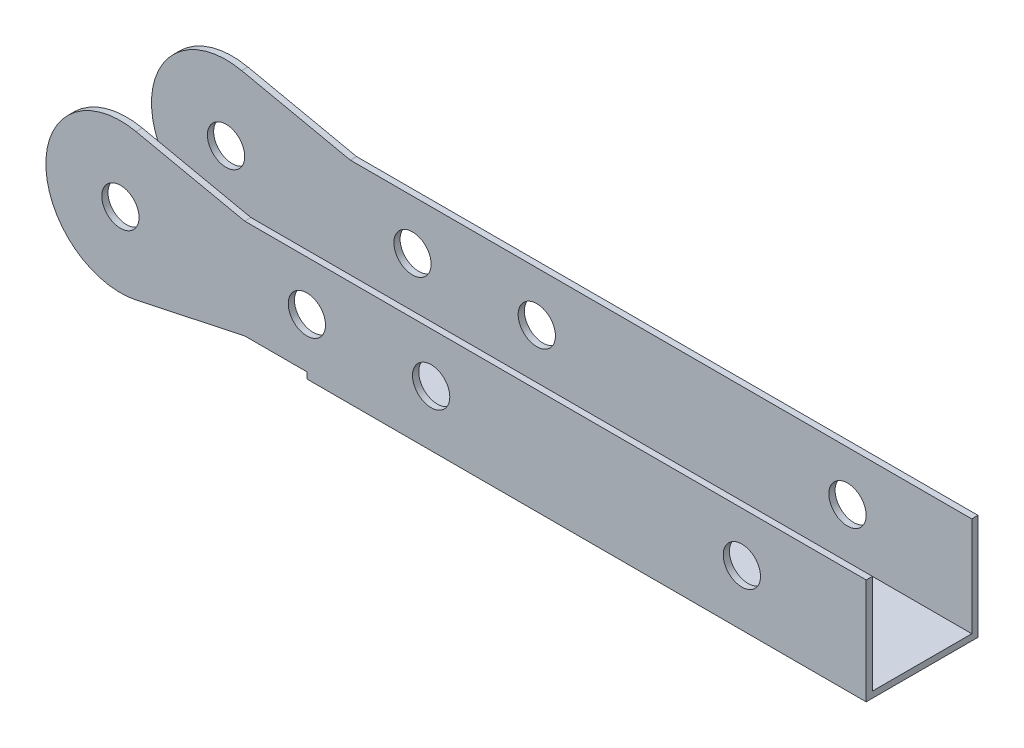
ISO-10303-21;
HEADER;
FILE_DESCRIPTION(('STEP AP214'),'2;1');
FILE_NAME('part.step','',(''),(''),'','','');
FILE_SCHEMA(('AUTOMOTIVE_DESIGN { 1 0 10303 214 1 1 1 1 }'));
ENDSEC;
DATA;
#1=APPLICATION_CONTEXT('core data for automotive mechanical design processes');
#2=APPLICATION_PROTOCOL_DEFINITION('international standard','automotive_design',2000,#1);
#3=PRODUCT_CONTEXT('',#1,'mechanical');
#4=PRODUCT('Part','Part','',(#3));
#5=PRODUCT_RELATED_PRODUCT_CATEGORY('part','',(#4));
#6=PRODUCT_DEFINITION_FORMATION('','',#4);
#7=PRODUCT_DEFINITION_CONTEXT('part definition',#1,'design');
#8=PRODUCT_DEFINITION('design','',#6,#7);
#9=PRODUCT_DEFINITION_SHAPE('','',#8);
#10=(LENGTH_UNIT() NAMED_UNIT(*) SI_UNIT(.MILLI.,.METRE.));
#11=(NAMED_UNIT(*) PLANE_ANGLE_UNIT() SI_UNIT($,.RADIAN.));
#12=(NAMED_UNIT(*) SI_UNIT($,.STERADIAN.) SOLID_ANGLE_UNIT());
#13=UNCERTAINTY_MEASURE_WITH_UNIT(LENGTH_MEASURE(1.E-05),#10,'distance_accuracy_value','');
#14=(GEOMETRIC_REPRESENTATION_CONTEXT(3) GLOBAL_UNCERTAINTY_ASSIGNED_CONTEXT((#13)) GLOBAL_UNIT_ASSIGNED_CONTEXT((#10,
#11,#12)) REPRESENTATION_CONTEXT('',''));
#15=CARTESIAN_POINT('',(0.,0.,0.));
#16=DIRECTION('',(0.,0.,1.));
#17=DIRECTION('',(1.,0.,0.));
#18=AXIS2_PLACEMENT_3D('',#15,#16,#17);
#19=CARTESIAN_POINT('',(-26.8000000000001,0.0103930383316599,8.5));
#20=DIRECTION('',(0.,1.,0.));
#21=DIRECTION('',(0.,0.,1.));
#22=AXIS2_PLACEMENT_3D('',#19,#20,#21);
#23=PLANE('',#22);
#24=DIRECTION('',(0.,0.,-1.));
#25=VECTOR('',#24,1.);
#26=CARTESIAN_POINT('',(-21.8000000000001,0.0103930383316599,-0.500000000000006));
#27=LINE('',#26,#25);
#28=CARTESIAN_POINT('',(-21.8000000000001,0.0103930383316599,8.5));
#29=VERTEX_POINT('',#28);
#30=CARTESIAN_POINT('',(-21.8000000000001,0.0103930383316599,8.));
#31=VERTEX_POINT('',#30);
#32=EDGE_CURVE('E152',#29,#31,#27,.T.);
#33=ORIENTED_EDGE('',*,*,#32,.F.);
#34=DIRECTION('',(1.,0.,0.));
#35=VECTOR('',#34,1.);
#36=CARTESIAN_POINT('',(-26.8000000000001,0.0103930383316599,8.5));
#37=LINE('',#36,#35);
#38=CARTESIAN_POINT('',(-26.8000000000001,0.0103930383316599,8.5));
#39=VERTEX_POINT('',#38);
#40=EDGE_CURVE('E120',#39,#29,#37,.T.);
#41=ORIENTED_EDGE('',*,*,#40,.F.);
#42=DIRECTION('',(0.,0.,-1.));
#43=VECTOR('',#42,1.);
#44=CARTESIAN_POINT('',(-26.8000000000001,0.0103930383316599,8.5));
#45=LINE('',#44,#43);
#46=CARTESIAN_POINT('',(-26.8000000000001,0.0103930383316599,8.));
#47=VERTEX_POINT('',#46);
#48=EDGE_CURVE('E115',#39,#47,#45,.T.);
#49=ORIENTED_EDGE('',*,*,#48,.T.);
#50=DIRECTION('',(1.,0.,0.));
#51=VECTOR('',#50,1.);
#52=CARTESIAN_POINT('',(-26.8000000000001,0.0103930383316599,8.));
#53=LINE('',#52,#51);
#54=EDGE_CURVE('E136',#47,#31,#53,.T.);
#55=ORIENTED_EDGE('',*,*,#54,.T.);
#56=EDGE_LOOP('',(#33,#41,#49,#55));
#57=FACE_BOUND('',#56,.T.);
#58=ADVANCED_FACE('F37',(#57),#23,.F.);
#59=CARTESIAN_POINT('',(-36.8000000000001,4.01039303833166,8.5));
#60=DIRECTION('',(0.,0.,1.));
#61=DIRECTION('',(1.,0.,0.));
#62=AXIS2_PLACEMENT_3D('',#59,#60,#61);
#63=PLANE('',#62);
#64=CARTESIAN_POINT('',(-21.8000000000001,4.01039303833166,8.5));
#65=DIRECTION('',(0.,0.,1.));
#66=DIRECTION('',(1.,0.,0.));
#67=AXIS2_PLACEMENT_3D('',#64,#65,#66);
#68=CIRCLE('',#67,1.5);
#69=CARTESIAN_POINT('',(-20.3000000000001,4.01039303833166,8.5));
#70=VERTEX_POINT('',#69);
#71=EDGE_CURVE('E300',#70,#70,#68,.T.);
#72=ORIENTED_EDGE('',*,*,#71,.F.);
#73=EDGE_LOOP('',(#72));
#74=FACE_BOUND('',#73,.T.);
#75=CARTESIAN_POINT('',(13.1999999999999,4.01039303833166,8.5));
#76=DIRECTION('',(0.,0.,1.));
#77=DIRECTION('',(1.,0.,0.));
#78=AXIS2_PLACEMENT_3D('',#75,#76,#77);
#79=CIRCLE('',#78,1.5);
#80=CARTESIAN_POINT('',(14.6999999999999,4.01039303833166,8.5));
#81=VERTEX_POINT('',#80);
#82=EDGE_CURVE('E131',#81,#81,#79,.T.);
#83=ORIENTED_EDGE('',*,*,#82,.F.);
#84=EDGE_LOOP('',(#83));
#85=FACE_BOUND('',#84,.T.);
#86=DIRECTION('',(-1.,0.,0.));
#87=VECTOR('',#86,1.);
#88=CARTESIAN_POINT('',(23.1999999999999,8.01039303833166,8.5));
#89=LINE('',#88,#87);
#90=CARTESIAN_POINT('',(23.1999999999999,8.01039303833166,8.5));
#91=VERTEX_POINT('',#90);
#92=CARTESIAN_POINT('',(-26.8000000000001,8.01039303833165,8.5));
#93=VERTEX_POINT('',#92);
#94=EDGE_CURVE('E140',#91,#93,#89,.T.);
#95=ORIENTED_EDGE('',*,*,#94,.T.);
#96=DIRECTION('',(-0.977954474999927,0.20881821000003,0.));
#97=VECTOR('',#96,1.);
#98=CARTESIAN_POINT('',(-26.8000000000001,8.01039303833165,8.5));
#99=LINE('',#98,#97);
#100=CARTESIAN_POINT('',(-35.5470907399999,9.87811988833122,8.5));
#101=VERTEX_POINT('',#100);
#102=EDGE_CURVE('E91',#93,#101,#99,.T.);
#103=ORIENTED_EDGE('',*,*,#102,.T.);
#104=CARTESIAN_POINT('',(-36.8000000000001,4.01039303833166,8.5));
#105=DIRECTION('',(0.,0.,1.));
#106=DIRECTION('',(1.,0.,0.));
#107=AXIS2_PLACEMENT_3D('',#104,#105,#106);
#108=CIRCLE('',#107,6.);
#109=CARTESIAN_POINT('',(-35.5470907399999,-1.85733381166791,8.5));
#110=VERTEX_POINT('',#109);
#111=EDGE_CURVE('E97',#101,#110,#108,.T.);
#112=ORIENTED_EDGE('',*,*,#111,.T.);
#113=DIRECTION('',(0.977954474999928,0.208818210000029,0.));
#114=VECTOR('',#113,1.);
#115=CARTESIAN_POINT('',(-35.5470907399999,-1.85733381166791,8.5));
#116=LINE('',#115,#114);
#117=EDGE_CURVE('E103',#110,#39,#116,.T.);
#118=ORIENTED_EDGE('',*,*,#117,.T.);
#119=ORIENTED_EDGE('',*,*,#40,.T.);
#120=DIRECTION('',(0.,1.,0.));
#121=VECTOR('',#120,1.);
#122=CARTESIAN_POINT('',(-21.8000000000001,-0.48960696166834,8.5));
#123=LINE('',#122,#121);
#124=CARTESIAN_POINT('',(-21.8000000000001,-0.48960696166834,8.5));
#125=VERTEX_POINT('',#124);
#126=EDGE_CURVE('E156',#125,#29,#123,.T.);
#127=ORIENTED_EDGE('',*,*,#126,.F.);
#128=DIRECTION('',(-1.,0.,0.));
#129=VECTOR('',#128,1.);
#130=CARTESIAN_POINT('',(-21.8000000000001,-0.48960696166834,8.5));
#131=LINE('',#130,#129);
#132=CARTESIAN_POINT('',(23.1999999999999,-0.48960696166834,8.5));
#133=VERTEX_POINT('',#132);
#134=EDGE_CURVE('E274',#133,#125,#131,.T.);
#135=ORIENTED_EDGE('',*,*,#134,.F.);
#136=DIRECTION('',(0.,1.,0.));
#137=VECTOR('',#136,1.);
#138=CARTESIAN_POINT('',(23.1999999999999,0.0103930383316599,8.5));
#139=LINE('',#138,#137);
#140=EDGE_CURVE('E54',#133,#91,#139,.T.);
#141=ORIENTED_EDGE('',*,*,#140,.T.);
#142=EDGE_LOOP('',(#95,#103,#112,#118,#119,#127,#135,#141));
#143=FACE_BOUND('',#142,.T.);
#144=CARTESIAN_POINT('',(-11.8000000000001,4.01039303833166,8.5));
#145=DIRECTION('',(0.,0.,1.));
#146=DIRECTION('',(1.,0.,0.));
#147=AXIS2_PLACEMENT_3D('',#144,#145,#146);
#148=CIRCLE('',#147,1.5);
#149=CARTESIAN_POINT('',(-10.3000000000001,4.01039303833166,8.5));
#150=VERTEX_POINT('',#149);
#151=EDGE_CURVE('E306',#150,#150,#148,.T.);
#152=ORIENTED_EDGE('',*,*,#151,.F.);
#153=EDGE_LOOP('',(#152));
#154=FACE_BOUND('',#153,.T.);
#155=CARTESIAN_POINT('',(-36.8000000000001,4.01039303833166,8.5));
#156=DIRECTION('',(0.,0.,1.));
#157=DIRECTION('',(1.,0.,0.));
#158=AXIS2_PLACEMENT_3D('',#155,#156,#157);
#159=CIRCLE('',#158,1.5);
#160=CARTESIAN_POINT('',(-35.3000000000001,4.01039303833166,8.5));
#161=VERTEX_POINT('',#160);
#162=EDGE_CURVE('E294',#161,#161,#159,.T.);
#163=ORIENTED_EDGE('',*,*,#162,.F.);
#164=EDGE_LOOP('',(#163));
#165=FACE_BOUND('',#164,.T.);
#166=ADVANCED_FACE('F99',(#74,#85,#143,#154,#165),#63,.T.);
#167=CARTESIAN_POINT('',(-36.8000000000001,4.01039303833166,8.));
#168=DIRECTION('',(0.,0.,1.));
#169=DIRECTION('',(1.,0.,0.));
#170=AXIS2_PLACEMENT_3D('',#167,#168,#169);
#171=PLANE('',#170);
#172=DIRECTION('',(-1.,0.,0.));
#173=VECTOR('',#172,1.);
#174=CARTESIAN_POINT('',(23.1999999999999,8.01039303833166,8.));
#175=LINE('',#174,#173);
#176=CARTESIAN_POINT('',(23.1999999999999,8.01039303833166,8.));
#177=VERTEX_POINT('',#176);
#178=CARTESIAN_POINT('',(-26.8000000000001,8.01039303833165,8.));
#179=VERTEX_POINT('',#178);
#180=EDGE_CURVE('E127',#177,#179,#175,.T.);
#181=ORIENTED_EDGE('',*,*,#180,.F.);
#182=DIRECTION('',(0.,1.,0.));
#183=VECTOR('',#182,1.);
#184=CARTESIAN_POINT('',(23.1999999999999,0.0103930383316599,8.));
#185=LINE('',#184,#183);
#186=CARTESIAN_POINT('',(23.1999999999999,0.0103930383316599,8.));
#187=VERTEX_POINT('',#186);
#188=EDGE_CURVE('E83',#187,#177,#185,.T.);
#189=ORIENTED_EDGE('',*,*,#188,.F.);
#190=DIRECTION('',(-1.,0.,0.));
#191=VECTOR('',#190,1.);
#192=CARTESIAN_POINT('',(-36.8000000000001,0.0103930383316599,8.));
#193=LINE('',#192,#191);
#194=EDGE_CURVE('E291',#187,#31,#193,.T.);
#195=ORIENTED_EDGE('',*,*,#194,.T.);
#196=ORIENTED_EDGE('',*,*,#54,.F.);
#197=DIRECTION('',(0.977954474999928,0.208818210000029,0.));
#198=VECTOR('',#197,1.);
#199=CARTESIAN_POINT('',(-35.5470907399999,-1.85733381166791,8.));
#200=LINE('',#199,#198);
#201=CARTESIAN_POINT('',(-35.5470907399999,-1.85733381166791,8.));
#202=VERTEX_POINT('',#201);
#203=EDGE_CURVE('E134',#202,#47,#200,.T.);
#204=ORIENTED_EDGE('',*,*,#203,.F.);
#205=CARTESIAN_POINT('',(-36.8000000000001,4.01039303833166,8.));
#206=DIRECTION('',(0.,0.,1.));
#207=DIRECTION('',(1.,0.,0.));
#208=AXIS2_PLACEMENT_3D('',#205,#206,#207);
#209=CIRCLE('',#208,6.);
#210=CARTESIAN_POINT('',(-35.5470907399999,9.87811988833122,8.));
#211=VERTEX_POINT('',#210);
#212=EDGE_CURVE('E112',#211,#202,#209,.T.);
#213=ORIENTED_EDGE('',*,*,#212,.F.);
#214=DIRECTION('',(-0.977954474999927,0.20881821000003,0.));
#215=VECTOR('',#214,1.);
#216=CARTESIAN_POINT('',(-26.8000000000001,8.01039303833165,8.));
#217=LINE('',#216,#215);
#218=EDGE_CURVE('E130',#179,#211,#217,.T.);
#219=ORIENTED_EDGE('',*,*,#218,.F.);
#220=EDGE_LOOP('',(#181,#189,#195,#196,#204,#213,#219));
#221=FACE_BOUND('',#220,.T.);
#222=CARTESIAN_POINT('',(13.1999999999999,4.01039303833166,8.));
#223=DIRECTION('',(0.,0.,1.));
#224=DIRECTION('',(1.,0.,0.));
#225=AXIS2_PLACEMENT_3D('',#222,#223,#224);
#226=CIRCLE('',#225,1.5);
#227=CARTESIAN_POINT('',(14.6999999999999,4.01039303833166,8.));
#228=VERTEX_POINT('',#227);
#229=EDGE_CURVE('E309',#228,#228,#226,.T.);
#230=ORIENTED_EDGE('',*,*,#229,.T.);
#231=EDGE_LOOP('',(#230));
#232=FACE_BOUND('',#231,.T.);
#233=CARTESIAN_POINT('',(-11.8000000000001,4.01039303833166,8.));
#234=DIRECTION('',(0.,0.,1.));
#235=DIRECTION('',(1.,0.,0.));
#236=AXIS2_PLACEMENT_3D('',#233,#234,#235);
#237=CIRCLE('',#236,1.5);
#238=CARTESIAN_POINT('',(-10.3000000000001,4.01039303833166,8.));
#239=VERTEX_POINT('',#238);
#240=EDGE_CURVE('E303',#239,#239,#237,.T.);
#241=ORIENTED_EDGE('',*,*,#240,.T.);
#242=EDGE_LOOP('',(#241));
#243=FACE_BOUND('',#242,.T.);
#244=CARTESIAN_POINT('',(-21.8000000000001,4.01039303833166,8.));
#245=DIRECTION('',(0.,0.,1.));
#246=DIRECTION('',(1.,0.,0.));
#247=AXIS2_PLACEMENT_3D('',#244,#245,#246);
#248=CIRCLE('',#247,1.5);
#249=CARTESIAN_POINT('',(-20.3000000000001,4.01039303833166,8.));
#250=VERTEX_POINT('',#249);
#251=EDGE_CURVE('E297',#250,#250,#248,.T.);
#252=ORIENTED_EDGE('',*,*,#251,.T.);
#253=EDGE_LOOP('',(#252));
#254=FACE_BOUND('',#253,.T.);
#255=CARTESIAN_POINT('',(-36.8000000000001,4.01039303833166,8.));
#256=DIRECTION('',(0.,0.,1.));
#257=DIRECTION('',(1.,0.,0.));
#258=AXIS2_PLACEMENT_3D('',#255,#256,#257);
#259=CIRCLE('',#258,1.5);
#260=CARTESIAN_POINT('',(-35.3000000000001,4.01039303833166,8.));
#261=VERTEX_POINT('',#260);
#262=EDGE_CURVE('E293',#261,#261,#259,.T.);
#263=ORIENTED_EDGE('',*,*,#262,.T.);
#264=EDGE_LOOP('',(#263));
#265=FACE_BOUND('',#264,.T.);
#266=ADVANCED_FACE('F144',(#221,#232,#243,#254,#265),#171,.F.);
#267=CARTESIAN_POINT('',(23.1999999999999,8.01039303833166,8.5));
#268=DIRECTION('',(0.,-1.,0.));
#269=DIRECTION('',(1.,0.,0.));
#270=AXIS2_PLACEMENT_3D('',#267,#268,#269);
#271=PLANE('',#270);
#272=ORIENTED_EDGE('',*,*,#180,.T.);
#273=DIRECTION('',(0.,0.,-1.));
#274=VECTOR('',#273,1.);
#275=CARTESIAN_POINT('',(-26.8000000000001,8.01039303833165,8.5));
#276=LINE('',#275,#274);
#277=EDGE_CURVE('E11',#93,#179,#276,.T.);
#278=ORIENTED_EDGE('',*,*,#277,.F.);
#279=ORIENTED_EDGE('',*,*,#94,.F.);
#280=DIRECTION('',(0.,0.,-1.));
#281=VECTOR('',#280,1.);
#282=CARTESIAN_POINT('',(23.1999999999999,8.01039303833166,8.5));
#283=LINE('',#282,#281);
#284=EDGE_CURVE('E126',#91,#177,#283,.T.);
#285=ORIENTED_EDGE('',*,*,#284,.T.);
#286=EDGE_LOOP('',(#272,#278,#279,#285));
#287=FACE_BOUND('',#286,.T.);
#288=ADVANCED_FACE('F39',(#287),#271,.F.);
#289=CARTESIAN_POINT('',(-26.8000000000001,8.01039303833165,8.5));
#290=DIRECTION('',(-0.20881821000003,-0.977954474999927,0.));
#291=DIRECTION('',(0.977954474999927,-0.20881821000003,0.));
#292=AXIS2_PLACEMENT_3D('',#289,#290,#291);
#293=PLANE('',#292);
#294=ORIENTED_EDGE('',*,*,#218,.T.);
#295=DIRECTION('',(0.,0.,-1.));
#296=VECTOR('',#295,1.);
#297=CARTESIAN_POINT('',(-35.5470907399999,9.87811988833122,8.5));
#298=LINE('',#297,#296);
#299=EDGE_CURVE('E46',#101,#211,#298,.T.);
#300=ORIENTED_EDGE('',*,*,#299,.F.);
#301=ORIENTED_EDGE('',*,*,#102,.F.);
#302=ORIENTED_EDGE('',*,*,#277,.T.);
#303=EDGE_LOOP('',(#294,#300,#301,#302));
#304=FACE_BOUND('',#303,.T.);
#305=ADVANCED_FACE('F319',(#304),#293,.F.);
#306=CARTESIAN_POINT('',(-36.8000000000001,4.01039303833166,8.5));
#307=DIRECTION('',(0.,0.,-1.));
#308=DIRECTION('',(-1.,0.,0.));
#309=AXIS2_PLACEMENT_3D('',#306,#307,#308);
#310=CYLINDRICAL_SURFACE('',#309,6.);
#311=ORIENTED_EDGE('',*,*,#212,.T.);
#312=DIRECTION('',(0.,0.,-1.));
#313=VECTOR('',#312,1.);
#314=CARTESIAN_POINT('',(-35.5470907399999,-1.85733381166791,8.5));
#315=LINE('',#314,#313);
#316=EDGE_CURVE('E109',#110,#202,#315,.T.);
#317=ORIENTED_EDGE('',*,*,#316,.F.);
#318=ORIENTED_EDGE('',*,*,#111,.F.);
#319=ORIENTED_EDGE('',*,*,#299,.T.);
#320=EDGE_LOOP('',(#311,#317,#318,#319));
#321=FACE_BOUND('',#320,.T.);
#322=ADVANCED_FACE('F110',(#321),#310,.T.);
#323=CARTESIAN_POINT('',(-35.5470907399999,-1.85733381166791,8.5));
#324=DIRECTION('',(-0.208818210000029,0.977954474999927,0.));
#325=DIRECTION('',(-0.977954474999927,-0.208818210000029,0.));
#326=AXIS2_PLACEMENT_3D('',#323,#324,#325);
#327=PLANE('',#326);
#328=ORIENTED_EDGE('',*,*,#203,.T.);
#329=ORIENTED_EDGE('',*,*,#48,.F.);
#330=ORIENTED_EDGE('',*,*,#117,.F.);
#331=ORIENTED_EDGE('',*,*,#316,.T.);
#332=EDGE_LOOP('',(#328,#329,#330,#331));
#333=FACE_BOUND('',#332,.T.);
#334=ADVANCED_FACE('F117',(#333),#327,.F.);
#335=CARTESIAN_POINT('',(23.1999999999999,0.0103930383316599,8.5));
#336=DIRECTION('',(-1.,0.,0.));
#337=DIRECTION('',(0.,0.,1.));
#338=AXIS2_PLACEMENT_3D('',#335,#336,#337);
#339=PLANE('',#338);
#340=ORIENTED_EDGE('',*,*,#188,.T.);
#341=ORIENTED_EDGE('',*,*,#284,.F.);
#342=ORIENTED_EDGE('',*,*,#140,.F.);
#343=DIRECTION('',(0.,0.,1.));
#344=VECTOR('',#343,1.);
#345=CARTESIAN_POINT('',(23.1999999999999,-0.48960696166834,8.5));
#346=LINE('',#345,#344);
#347=CARTESIAN_POINT('',(23.1999999999999,-0.48960696166834,-0.5));
#348=VERTEX_POINT('',#347);
#349=EDGE_CURVE('E281',#348,#133,#346,.T.);
#350=ORIENTED_EDGE('',*,*,#349,.F.);
#351=DIRECTION('',(0.,1.,0.));
#352=VECTOR('',#351,1.);
#353=CARTESIAN_POINT('',(23.1999999999999,-0.48960696166834,-0.5));
#354=LINE('',#353,#352);
#355=CARTESIAN_POINT('',(23.1999999999999,8.01039303833166,-0.5));
#356=VERTEX_POINT('',#355);
#357=EDGE_CURVE('E284',#348,#356,#354,.T.);
#358=ORIENTED_EDGE('',*,*,#357,.T.);
#359=DIRECTION('',(0.,0.,1.));
#360=VECTOR('',#359,1.);
#361=CARTESIAN_POINT('',(23.1999999999999,8.01039303833166,-0.5));
#362=LINE('',#361,#360);
#363=CARTESIAN_POINT('',(23.1999999999999,8.01039303833166,0.));
#364=VERTEX_POINT('',#363);
#365=EDGE_CURVE('E266',#356,#364,#362,.T.);
#366=ORIENTED_EDGE('',*,*,#365,.T.);
#367=DIRECTION('',(0.,1.,0.));
#368=VECTOR('',#367,1.);
#369=CARTESIAN_POINT('',(23.1999999999999,8.01039303833166,0.));
#370=LINE('',#369,#368);
#371=CARTESIAN_POINT('',(23.1999999999999,0.0103930383316599,0.));
#372=VERTEX_POINT('',#371);
#373=EDGE_CURVE('E241',#372,#364,#370,.T.);
#374=ORIENTED_EDGE('',*,*,#373,.F.);
#375=DIRECTION('',(0.,0.,1.));
#376=VECTOR('',#375,1.);
#377=CARTESIAN_POINT('',(23.1999999999999,0.0103930383316599,8.5));
#378=LINE('',#377,#376);
#379=EDGE_CURVE('E79',#372,#187,#378,.T.);
#380=ORIENTED_EDGE('',*,*,#379,.T.);
#381=EDGE_LOOP('',(#340,#341,#342,#350,#358,#366,#374,#380));
#382=FACE_BOUND('',#381,.T.);
#383=ADVANCED_FACE('F335',(#382),#339,.F.);
#384=CARTESIAN_POINT('',(13.1999999999999,4.01039303833166,8.5));
#385=DIRECTION('',(0.,0.,-1.));
#386=DIRECTION('',(-1.,0.,0.));
#387=AXIS2_PLACEMENT_3D('',#384,#385,#386);
#388=CYLINDRICAL_SURFACE('',#387,1.5);
#389=ORIENTED_EDGE('',*,*,#82,.T.);
#390=EDGE_LOOP('',(#389));
#391=FACE_BOUND('',#390,.T.);
#392=ORIENTED_EDGE('',*,*,#229,.F.);
#393=EDGE_LOOP('',(#392));
#394=FACE_BOUND('',#393,.T.);
#395=ADVANCED_FACE('F341',(#391,#394),#388,.F.);
#396=CARTESIAN_POINT('',(-11.8000000000001,4.01039303833166,8.5));
#397=DIRECTION('',(0.,0.,-1.));
#398=DIRECTION('',(-1.,0.,0.));
#399=AXIS2_PLACEMENT_3D('',#396,#397,#398);
#400=CYLINDRICAL_SURFACE('',#399,1.5);
#401=ORIENTED_EDGE('',*,*,#151,.T.);
#402=EDGE_LOOP('',(#401));
#403=FACE_BOUND('',#402,.T.);
#404=ORIENTED_EDGE('',*,*,#240,.F.);
#405=EDGE_LOOP('',(#404));
#406=FACE_BOUND('',#405,.T.);
#407=ADVANCED_FACE('F345',(#403,#406),#400,.F.);
#408=CARTESIAN_POINT('',(-21.8000000000001,4.01039303833166,8.5));
#409=DIRECTION('',(0.,0.,-1.));
#410=DIRECTION('',(-1.,0.,0.));
#411=AXIS2_PLACEMENT_3D('',#408,#409,#410);
#412=CYLINDRICAL_SURFACE('',#411,1.5);
#413=ORIENTED_EDGE('',*,*,#71,.T.);
#414=EDGE_LOOP('',(#413));
#415=FACE_BOUND('',#414,.T.);
#416=ORIENTED_EDGE('',*,*,#251,.F.);
#417=EDGE_LOOP('',(#416));
#418=FACE_BOUND('',#417,.T.);
#419=ADVANCED_FACE('F351',(#415,#418),#412,.F.);
#420=CARTESIAN_POINT('',(-36.8000000000001,4.01039303833166,8.5));
#421=DIRECTION('',(0.,0.,-1.));
#422=DIRECTION('',(-1.,0.,0.));
#423=AXIS2_PLACEMENT_3D('',#420,#421,#422);
#424=CYLINDRICAL_SURFACE('',#423,1.5);
#425=ORIENTED_EDGE('',*,*,#162,.T.);
#426=EDGE_LOOP('',(#425));
#427=FACE_BOUND('',#426,.T.);
#428=ORIENTED_EDGE('',*,*,#262,.F.);
#429=EDGE_LOOP('',(#428));
#430=FACE_BOUND('',#429,.T.);
#431=ADVANCED_FACE('F399',(#427,#430),#424,.F.);
#432=CARTESIAN_POINT('',(0.,0.0103930383316599,0.));
#433=DIRECTION('',(0.,1.,0.));
#434=DIRECTION('',(0.,0.,1.));
#435=AXIS2_PLACEMENT_3D('',#432,#433,#434);
#436=PLANE('',#435);
#437=DIRECTION('',(1.,0.,0.));
#438=VECTOR('',#437,1.);
#439=CARTESIAN_POINT('',(-26.8000000000001,0.0103930383316599,0.));
#440=LINE('',#439,#438);
#441=CARTESIAN_POINT('',(-21.8000000000001,0.0103930383316599,0.));
#442=VERTEX_POINT('',#441);
#443=EDGE_CURVE('E258',#442,#372,#440,.T.);
#444=ORIENTED_EDGE('',*,*,#443,.F.);
#445=EDGE_CURVE('E273',#31,#442,#27,.T.);
#446=ORIENTED_EDGE('',*,*,#445,.F.);
#447=ORIENTED_EDGE('',*,*,#194,.F.);
#448=ORIENTED_EDGE('',*,*,#379,.F.);
#449=EDGE_LOOP('',(#444,#446,#447,#448));
#450=FACE_BOUND('',#449,.T.);
#451=ADVANCED_FACE('F407',(#450),#436,.T.);
#452=CARTESIAN_POINT('',(-21.8000000000001,-0.48960696166834,-0.500000000000006));
#453=DIRECTION('',(1.,0.,0.));
#454=DIRECTION('',(0.,0.,-1.));
#455=AXIS2_PLACEMENT_3D('',#452,#453,#454);
#456=PLANE('',#455);
#457=ORIENTED_EDGE('',*,*,#32,.T.);
#458=ORIENTED_EDGE('',*,*,#445,.T.);
#459=DIRECTION('',(0.,0.,-1.));
#460=VECTOR('',#459,1.);
#461=CARTESIAN_POINT('',(-21.8000000000001,0.0103930383316599,-0.500000000000006));
#462=LINE('',#461,#460);
#463=CARTESIAN_POINT('',(-21.8000000000001,0.0103930383316599,-0.5));
#464=VERTEX_POINT('',#463);
#465=EDGE_CURVE('E265',#442,#464,#462,.T.);
#466=ORIENTED_EDGE('',*,*,#465,.T.);
#467=DIRECTION('',(0.,1.,0.));
#468=VECTOR('',#467,1.);
#469=CARTESIAN_POINT('',(-21.8000000000001,-0.48960696166834,-0.500000000000006));
#470=LINE('',#469,#468);
#471=CARTESIAN_POINT('',(-21.8000000000001,-0.48960696166834,-0.500000000000006));
#472=VERTEX_POINT('',#471);
#473=EDGE_CURVE('E288',#472,#464,#470,.T.);
#474=ORIENTED_EDGE('',*,*,#473,.F.);
#475=DIRECTION('',(0.,0.,-1.));
#476=VECTOR('',#475,1.);
#477=CARTESIAN_POINT('',(-21.8000000000001,-0.48960696166834,-0.500000000000006));
#478=LINE('',#477,#476);
#479=EDGE_CURVE('E277',#125,#472,#478,.T.);
#480=ORIENTED_EDGE('',*,*,#479,.F.);
#481=ORIENTED_EDGE('',*,*,#126,.T.);
#482=EDGE_LOOP('',(#457,#458,#466,#474,#480,#481));
#483=FACE_BOUND('',#482,.T.);
#484=ADVANCED_FACE('F439',(#483),#456,.F.);
#485=CARTESIAN_POINT('',(23.1999999999999,-0.48960696166834,-0.5));
#486=DIRECTION('',(0.,0.,1.));
#487=DIRECTION('',(1.,0.,0.));
#488=AXIS2_PLACEMENT_3D('',#485,#486,#487);
#489=PLANE('',#488);
#490=ORIENTED_EDGE('',*,*,#473,.T.);
#491=DIRECTION('',(1.,0.,0.));
#492=VECTOR('',#491,1.);
#493=CARTESIAN_POINT('',(-26.8000000000001,0.0103930383316599,-0.5));
#494=LINE('',#493,#492);
#495=CARTESIAN_POINT('',(-26.8000000000001,0.0103930383316599,-0.5));
#496=VERTEX_POINT('',#495);
#497=EDGE_CURVE('E248',#496,#464,#494,.T.);
#498=ORIENTED_EDGE('',*,*,#497,.F.);
#499=DIRECTION('',(0.977954474999928,0.208818210000029,0.));
#500=VECTOR('',#499,1.);
#501=CARTESIAN_POINT('',(-26.8000000000001,0.0103930383316599,-0.5));
#502=LINE('',#501,#500);
#503=CARTESIAN_POINT('',(-35.5470907399999,-1.8573338116679,-0.5));
#504=VERTEX_POINT('',#503);
#505=EDGE_CURVE('E234',#504,#496,#502,.T.);
#506=ORIENTED_EDGE('',*,*,#505,.F.);
#507=CARTESIAN_POINT('',(-36.8000000000001,4.01039303833166,-0.5));
#508=DIRECTION('',(0.,0.,1.));
#509=DIRECTION('',(1.,0.,0.));
#510=AXIS2_PLACEMENT_3D('',#507,#508,#509);
#511=CIRCLE('',#510,6.);
#512=CARTESIAN_POINT('',(-35.5470907399999,9.87811988833122,-0.5));
#513=VERTEX_POINT('',#512);
#514=EDGE_CURVE('E213',#513,#504,#511,.T.);
#515=ORIENTED_EDGE('',*,*,#514,.F.);
#516=DIRECTION('',(-0.977954474999927,0.20881821000003,0.));
#517=VECTOR('',#516,1.);
#518=CARTESIAN_POINT('',(-26.8000000000001,8.01039303833165,-0.5));
#519=LINE('',#518,#517);
#520=CARTESIAN_POINT('',(-26.8000000000001,8.01039303833165,-0.5));
#521=VERTEX_POINT('',#520);
#522=EDGE_CURVE('E230',#521,#513,#519,.T.);
#523=ORIENTED_EDGE('',*,*,#522,.F.);
#524=DIRECTION('',(-1.,0.,0.));
#525=VECTOR('',#524,1.);
#526=CARTESIAN_POINT('',(23.1999999999999,8.01039303833166,-0.5));
#527=LINE('',#526,#525);
#528=EDGE_CURVE('E221',#356,#521,#527,.T.);
#529=ORIENTED_EDGE('',*,*,#528,.F.);
#530=ORIENTED_EDGE('',*,*,#357,.F.);
#531=DIRECTION('',(1.,0.,0.));
#532=VECTOR('',#531,1.);
#533=CARTESIAN_POINT('',(23.1999999999999,-0.48960696166834,-0.5));
#534=LINE('',#533,#532);
#535=EDGE_CURVE('E279',#472,#348,#534,.T.);
#536=ORIENTED_EDGE('',*,*,#535,.F.);
#537=EDGE_LOOP('',(#490,#498,#506,#515,#523,#529,#530,#536));
#538=FACE_BOUND('',#537,.T.);
#539=CARTESIAN_POINT('',(13.1999999999999,4.01039303833166,-0.5));
#540=DIRECTION('',(0.,0.,1.));
#541=DIRECTION('',(1.,0.,0.));
#542=AXIS2_PLACEMENT_3D('',#539,#540,#541);
#543=CIRCLE('',#542,1.5);
#544=CARTESIAN_POINT('',(14.6999999999999,4.01039303833166,-0.5));
#545=VERTEX_POINT('',#544);
#546=EDGE_CURVE('E566',#545,#545,#543,.T.);
#547=ORIENTED_EDGE('',*,*,#546,.T.);
#548=EDGE_LOOP('',(#547));
#549=FACE_BOUND('',#548,.T.);
#550=CARTESIAN_POINT('',(-11.8000000000001,4.01039303833166,-0.5));
#551=DIRECTION('',(0.,0.,1.));
#552=DIRECTION('',(1.,0.,0.));
#553=AXIS2_PLACEMENT_3D('',#550,#551,#552);
#554=CIRCLE('',#553,1.5);
#555=CARTESIAN_POINT('',(-10.3000000000001,4.01039303833166,-0.5));
#556=VERTEX_POINT('',#555);
#557=EDGE_CURVE('E574',#556,#556,#554,.T.);
#558=ORIENTED_EDGE('',*,*,#557,.T.);
#559=EDGE_LOOP('',(#558));
#560=FACE_BOUND('',#559,.T.);
#561=CARTESIAN_POINT('',(-21.8000000000001,4.01039303833166,-0.5));
#562=DIRECTION('',(0.,0.,1.));
#563=DIRECTION('',(1.,0.,0.));
#564=AXIS2_PLACEMENT_3D('',#561,#562,#563);
#565=CIRCLE('',#564,1.5);
#566=CARTESIAN_POINT('',(-20.3000000000001,4.01039303833166,-0.5));
#567=VERTEX_POINT('',#566);
#568=EDGE_CURVE('E580',#567,#567,#565,.T.);
#569=ORIENTED_EDGE('',*,*,#568,.T.);
#570=EDGE_LOOP('',(#569));
#571=FACE_BOUND('',#570,.T.);
#572=CARTESIAN_POINT('',(-36.8000000000001,4.01039303833166,-0.5));
#573=DIRECTION('',(0.,0.,1.));
#574=DIRECTION('',(1.,0.,0.));
#575=AXIS2_PLACEMENT_3D('',#572,#573,#574);
#576=CIRCLE('',#575,1.5);
#577=CARTESIAN_POINT('',(-35.3000000000001,4.01039303833166,-0.5));
#578=VERTEX_POINT('',#577);
#579=EDGE_CURVE('E253',#578,#578,#576,.T.);
#580=ORIENTED_EDGE('',*,*,#579,.T.);
#581=EDGE_LOOP('',(#580));
#582=FACE_BOUND('',#581,.T.);
#583=ADVANCED_FACE('F227',(#538,#549,#560,#571,#582),#489,.F.);
#584=CARTESIAN_POINT('',(0.,-0.48960696166834,0.));
#585=DIRECTION('',(0.,1.,0.));
#586=DIRECTION('',(0.,0.,1.));
#587=AXIS2_PLACEMENT_3D('',#584,#585,#586);
#588=PLANE('',#587);
#589=ORIENTED_EDGE('',*,*,#134,.T.);
#590=ORIENTED_EDGE('',*,*,#479,.T.);
#591=ORIENTED_EDGE('',*,*,#535,.T.);
#592=ORIENTED_EDGE('',*,*,#349,.T.);
#593=EDGE_LOOP('',(#589,#590,#591,#592));
#594=FACE_BOUND('',#593,.T.);
#595=ADVANCED_FACE('F455',(#594),#588,.F.);
#596=CARTESIAN_POINT('',(-26.8000000000001,0.0103930383316599,-0.5));
#597=DIRECTION('',(0.,-1.,0.));
#598=DIRECTION('',(0.,0.,-1.));
#599=AXIS2_PLACEMENT_3D('',#596,#597,#598);
#600=PLANE('',#599);
#601=ORIENTED_EDGE('',*,*,#465,.F.);
#602=CARTESIAN_POINT('',(-26.8000000000001,0.0103930383316599,0.));
#603=VERTEX_POINT('',#602);
#604=EDGE_CURVE('E259',#603,#442,#440,.T.);
#605=ORIENTED_EDGE('',*,*,#604,.F.);
#606=DIRECTION('',(0.,0.,1.));
#607=VECTOR('',#606,1.);
#608=CARTESIAN_POINT('',(-26.8000000000001,0.0103930383316599,-0.5));
#609=LINE('',#608,#607);
#610=EDGE_CURVE('E268',#496,#603,#609,.T.);
#611=ORIENTED_EDGE('',*,*,#610,.F.);
#612=ORIENTED_EDGE('',*,*,#497,.T.);
#613=EDGE_LOOP('',(#601,#605,#611,#612));
#614=FACE_BOUND('',#613,.T.);
#615=ADVANCED_FACE('F465',(#614),#600,.T.);
#616=CARTESIAN_POINT('',(-26.8000000000001,8.01039303833165,-0.5));
#617=DIRECTION('',(0.20881821000003,0.977954474999927,0.));
#618=DIRECTION('',(-0.977954474999927,0.20881821000003,0.));
#619=AXIS2_PLACEMENT_3D('',#616,#617,#618);
#620=PLANE('',#619);
#621=DIRECTION('',(-0.977954474999927,0.20881821000003,0.));
#622=VECTOR('',#621,1.);
#623=CARTESIAN_POINT('',(-26.8000000000001,8.01039303833165,0.));
#624=LINE('',#623,#622);
#625=CARTESIAN_POINT('',(-26.8000000000001,8.01039303833165,0.));
#626=VERTEX_POINT('',#625);
#627=CARTESIAN_POINT('',(-35.5470907399999,9.87811988833122,0.));
#628=VERTEX_POINT('',#627);
#629=EDGE_CURVE('E251',#626,#628,#624,.T.);
#630=ORIENTED_EDGE('',*,*,#629,.F.);
#631=DIRECTION('',(0.,0.,1.));
#632=VECTOR('',#631,1.);
#633=CARTESIAN_POINT('',(-26.8000000000001,8.01039303833165,-0.5));
#634=LINE('',#633,#632);
#635=EDGE_CURVE('E237',#521,#626,#634,.T.);
#636=ORIENTED_EDGE('',*,*,#635,.F.);
#637=ORIENTED_EDGE('',*,*,#522,.T.);
#638=DIRECTION('',(0.,0.,1.));
#639=VECTOR('',#638,1.);
#640=CARTESIAN_POINT('',(-35.5470907399999,9.87811988833122,-0.5));
#641=LINE('',#640,#639);
#642=EDGE_CURVE('E210',#513,#628,#641,.T.);
#643=ORIENTED_EDGE('',*,*,#642,.T.);
#644=EDGE_LOOP('',(#630,#636,#637,#643));
#645=FACE_BOUND('',#644,.T.);
#646=ADVANCED_FACE('F236',(#645),#620,.T.);
#647=CARTESIAN_POINT('',(23.1999999999999,8.01039303833166,-0.5));
#648=DIRECTION('',(0.,1.,0.));
#649=DIRECTION('',(-1.,0.,0.));
#650=AXIS2_PLACEMENT_3D('',#647,#648,#649);
#651=PLANE('',#650);
#652=DIRECTION('',(-1.,0.,0.));
#653=VECTOR('',#652,1.);
#654=CARTESIAN_POINT('',(23.1999999999999,8.01039303833166,0.));
#655=LINE('',#654,#653);
#656=EDGE_CURVE('E238',#364,#626,#655,.T.);
#657=ORIENTED_EDGE('',*,*,#656,.F.);
#658=ORIENTED_EDGE('',*,*,#365,.F.);
#659=ORIENTED_EDGE('',*,*,#528,.T.);
#660=ORIENTED_EDGE('',*,*,#635,.T.);
#661=EDGE_LOOP('',(#657,#658,#659,#660));
#662=FACE_BOUND('',#661,.T.);
#663=ADVANCED_FACE('F483',(#662),#651,.T.);
#664=CARTESIAN_POINT('',(-26.8000000000001,0.0103930383316599,-0.5));
#665=DIRECTION('',(0.208818210000029,-0.977954474999927,0.));
#666=DIRECTION('',(0.977954474999928,0.208818210000029,0.));
#667=AXIS2_PLACEMENT_3D('',#664,#665,#666);
#668=PLANE('',#667);
#669=DIRECTION('',(0.977954474999928,0.208818210000029,0.));
#670=VECTOR('',#669,1.);
#671=CARTESIAN_POINT('',(-26.8000000000001,0.0103930383316599,0.));
#672=LINE('',#671,#670);
#673=CARTESIAN_POINT('',(-35.5470907399999,-1.8573338116679,0.));
#674=VERTEX_POINT('',#673);
#675=EDGE_CURVE('E255',#674,#603,#672,.T.);
#676=ORIENTED_EDGE('',*,*,#675,.F.);
#677=DIRECTION('',(0.,0.,1.));
#678=VECTOR('',#677,1.);
#679=CARTESIAN_POINT('',(-35.5470907399999,-1.8573338116679,-0.5));
#680=LINE('',#679,#678);
#681=EDGE_CURVE('E220',#504,#674,#680,.T.);
#682=ORIENTED_EDGE('',*,*,#681,.F.);
#683=ORIENTED_EDGE('',*,*,#505,.T.);
#684=ORIENTED_EDGE('',*,*,#610,.T.);
#685=EDGE_LOOP('',(#676,#682,#683,#684));
#686=FACE_BOUND('',#685,.T.);
#687=ADVANCED_FACE('F492',(#686),#668,.T.);
#688=CARTESIAN_POINT('',(-36.8000000000001,4.01039303833166,-0.5));
#689=DIRECTION('',(0.,0.,1.));
#690=DIRECTION('',(1.,0.,0.));
#691=AXIS2_PLACEMENT_3D('',#688,#689,#690);
#692=CYLINDRICAL_SURFACE('',#691,6.);
#693=CARTESIAN_POINT('',(-36.8000000000001,4.01039303833166,0.));
#694=DIRECTION('',(0.,0.,1.));
#695=DIRECTION('',(1.,0.,0.));
#696=AXIS2_PLACEMENT_3D('',#693,#694,#695);
#697=CIRCLE('',#696,6.);
#698=EDGE_CURVE('E215',#628,#674,#697,.T.);
#699=ORIENTED_EDGE('',*,*,#698,.F.);
#700=ORIENTED_EDGE('',*,*,#642,.F.);
#701=ORIENTED_EDGE('',*,*,#514,.T.);
#702=ORIENTED_EDGE('',*,*,#681,.T.);
#703=EDGE_LOOP('',(#699,#700,#701,#702));
#704=FACE_BOUND('',#703,.T.);
#705=ADVANCED_FACE('F212',(#704),#692,.T.);
#706=CARTESIAN_POINT('',(-36.8000000000001,4.01039303833166,0.));
#707=DIRECTION('',(0.,0.,1.));
#708=DIRECTION('',(1.,0.,0.));
#709=AXIS2_PLACEMENT_3D('',#706,#707,#708);
#710=PLANE('',#709);
#711=CARTESIAN_POINT('',(13.1999999999999,4.01039303833166,0.));
#712=DIRECTION('',(0.,0.,1.));
#713=DIRECTION('',(1.,0.,0.));
#714=AXIS2_PLACEMENT_3D('',#711,#712,#713);
#715=CIRCLE('',#714,1.5);
#716=CARTESIAN_POINT('',(14.6999999999999,4.01039303833166,0.));
#717=VERTEX_POINT('',#716);
#718=EDGE_CURVE('E569',#717,#717,#715,.T.);
#719=ORIENTED_EDGE('',*,*,#718,.F.);
#720=EDGE_LOOP('',(#719));
#721=FACE_BOUND('',#720,.T.);
#722=CARTESIAN_POINT('',(-11.8000000000001,4.01039303833166,0.));
#723=DIRECTION('',(0.,0.,1.));
#724=DIRECTION('',(1.,0.,0.));
#725=AXIS2_PLACEMENT_3D('',#722,#723,#724);
#726=CIRCLE('',#725,1.5);
#727=CARTESIAN_POINT('',(-10.3000000000001,4.01039303833166,0.));
#728=VERTEX_POINT('',#727);
#729=EDGE_CURVE('E571',#728,#728,#726,.T.);
#730=ORIENTED_EDGE('',*,*,#729,.F.);
#731=EDGE_LOOP('',(#730));
#732=FACE_BOUND('',#731,.T.);
#733=CARTESIAN_POINT('',(-21.8000000000001,4.01039303833166,0.));
#734=DIRECTION('',(0.,0.,1.));
#735=DIRECTION('',(1.,0.,0.));
#736=AXIS2_PLACEMENT_3D('',#733,#734,#735);
#737=CIRCLE('',#736,1.5);
#738=CARTESIAN_POINT('',(-20.3000000000001,4.01039303833166,0.));
#739=VERTEX_POINT('',#738);
#740=EDGE_CURVE('E577',#739,#739,#737,.T.);
#741=ORIENTED_EDGE('',*,*,#740,.F.);
#742=EDGE_LOOP('',(#741));
#743=FACE_BOUND('',#742,.T.);
#744=CARTESIAN_POINT('',(-36.8000000000001,4.01039303833166,0.));
#745=DIRECTION('',(0.,0.,1.));
#746=DIRECTION('',(1.,0.,0.));
#747=AXIS2_PLACEMENT_3D('',#744,#745,#746);
#748=CIRCLE('',#747,1.5);
#749=CARTESIAN_POINT('',(-35.3000000000001,4.01039303833166,0.));
#750=VERTEX_POINT('',#749);
#751=EDGE_CURVE('E244',#750,#750,#748,.T.);
#752=ORIENTED_EDGE('',*,*,#751,.F.);
#753=EDGE_LOOP('',(#752));
#754=FACE_BOUND('',#753,.T.);
#755=ORIENTED_EDGE('',*,*,#629,.T.);
#756=ORIENTED_EDGE('',*,*,#698,.T.);
#757=ORIENTED_EDGE('',*,*,#675,.T.);
#758=ORIENTED_EDGE('',*,*,#604,.T.);
#759=ORIENTED_EDGE('',*,*,#443,.T.);
#760=ORIENTED_EDGE('',*,*,#373,.T.);
#761=ORIENTED_EDGE('',*,*,#656,.T.);
#762=EDGE_LOOP('',(#755,#756,#757,#758,#759,#760,#761));
#763=FACE_BOUND('',#762,.T.);
#764=ADVANCED_FACE('F511',(#721,#732,#743,#754,#763),#710,.T.);
#765=CARTESIAN_POINT('',(-36.8000000000001,4.01039303833166,-0.5));
#766=DIRECTION('',(0.,0.,1.));
#767=DIRECTION('',(1.,0.,0.));
#768=AXIS2_PLACEMENT_3D('',#765,#766,#767);
#769=CYLINDRICAL_SURFACE('',#768,1.5);
#770=ORIENTED_EDGE('',*,*,#579,.F.);
#771=EDGE_LOOP('',(#770));
#772=FACE_BOUND('',#771,.T.);
#773=ORIENTED_EDGE('',*,*,#751,.T.);
#774=EDGE_LOOP('',(#773));
#775=FACE_BOUND('',#774,.T.);
#776=ADVANCED_FACE('F520',(#772,#775),#769,.F.);
#777=CARTESIAN_POINT('',(-21.8000000000001,4.01039303833166,-0.5));
#778=DIRECTION('',(0.,0.,1.));
#779=DIRECTION('',(1.,0.,0.));
#780=AXIS2_PLACEMENT_3D('',#777,#778,#779);
#781=CYLINDRICAL_SURFACE('',#780,1.5);
#782=ORIENTED_EDGE('',*,*,#568,.F.);
#783=EDGE_LOOP('',(#782));
#784=FACE_BOUND('',#783,.T.);
#785=ORIENTED_EDGE('',*,*,#740,.T.);
#786=EDGE_LOOP('',(#785));
#787=FACE_BOUND('',#786,.T.);
#788=ADVANCED_FACE('F530',(#784,#787),#781,.F.);
#789=CARTESIAN_POINT('',(-11.8000000000001,4.01039303833166,-0.5));
#790=DIRECTION('',(0.,0.,1.));
#791=DIRECTION('',(1.,0.,0.));
#792=AXIS2_PLACEMENT_3D('',#789,#790,#791);
#793=CYLINDRICAL_SURFACE('',#792,1.5);
#794=ORIENTED_EDGE('',*,*,#557,.F.);
#795=EDGE_LOOP('',(#794));
#796=FACE_BOUND('',#795,.T.);
#797=ORIENTED_EDGE('',*,*,#729,.T.);
#798=EDGE_LOOP('',(#797));
#799=FACE_BOUND('',#798,.T.);
#800=ADVANCED_FACE('F540',(#796,#799),#793,.F.);
#801=CARTESIAN_POINT('',(13.1999999999999,4.01039303833166,-0.5));
#802=DIRECTION('',(0.,0.,1.));
#803=DIRECTION('',(1.,0.,0.));
#804=AXIS2_PLACEMENT_3D('',#801,#802,#803);
#805=CYLINDRICAL_SURFACE('',#804,1.5);
#806=ORIENTED_EDGE('',*,*,#546,.F.);
#807=EDGE_LOOP('',(#806));
#808=FACE_BOUND('',#807,.T.);
#809=ORIENTED_EDGE('',*,*,#718,.T.);
#810=EDGE_LOOP('',(#809));
#811=FACE_BOUND('',#810,.T.);
#812=ADVANCED_FACE('F550',(#808,#811),#805,.F.);
#813=CLOSED_SHELL('',(#58,#166,#266,#288,#305,#322,#334,#383,#395,#407,#419,#431,#451,#484,#583,
#595,#615,#646,#663,#687,#705,#764,#776,#788,#800,#812));
#814=MANIFOLD_SOLID_BREP('B2',#813);
#815=ADVANCED_BREP_SHAPE_REPRESENTATION('',(#18,#814),#14);
#816=SHAPE_DEFINITION_REPRESENTATION(#9,#815);
ENDSEC;
END-ISO-10303-21;
